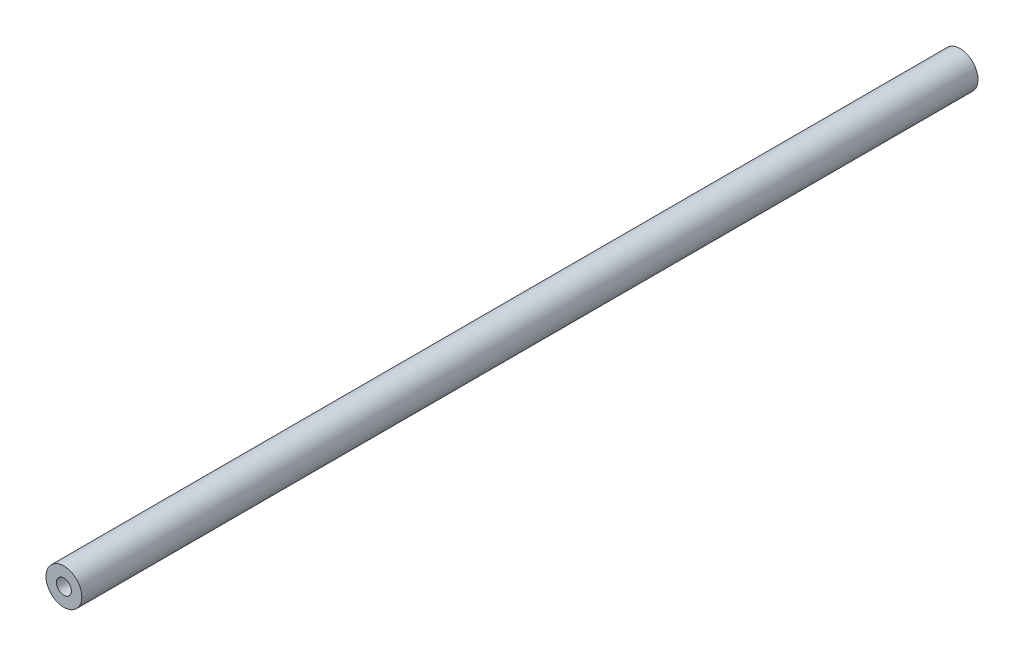
ISO-10303-21;
HEADER;
FILE_DESCRIPTION(('STEP AP214'),'2;1');
FILE_NAME('part.step','',(''),(''),'','','');
FILE_SCHEMA(('AUTOMOTIVE_DESIGN { 1 0 10303 214 1 1 1 1 }'));
ENDSEC;
DATA;
#1=APPLICATION_CONTEXT('core data for automotive mechanical design processes');
#2=APPLICATION_PROTOCOL_DEFINITION('international standard','automotive_design',2000,#1);
#3=PRODUCT_CONTEXT('',#1,'mechanical');
#4=PRODUCT('Part','Part','',(#3));
#5=PRODUCT_RELATED_PRODUCT_CATEGORY('part','',(#4));
#6=PRODUCT_DEFINITION_FORMATION('','',#4);
#7=PRODUCT_DEFINITION_CONTEXT('part definition',#1,'design');
#8=PRODUCT_DEFINITION('design','',#6,#7);
#9=PRODUCT_DEFINITION_SHAPE('','',#8);
#10=(LENGTH_UNIT() NAMED_UNIT(*) SI_UNIT(.MILLI.,.METRE.));
#11=(NAMED_UNIT(*) PLANE_ANGLE_UNIT() SI_UNIT($,.RADIAN.));
#12=(NAMED_UNIT(*) SI_UNIT($,.STERADIAN.) SOLID_ANGLE_UNIT());
#13=UNCERTAINTY_MEASURE_WITH_UNIT(LENGTH_MEASURE(1.E-05),#10,'distance_accuracy_value','');
#14=(GEOMETRIC_REPRESENTATION_CONTEXT(3) GLOBAL_UNCERTAINTY_ASSIGNED_CONTEXT((#13)) GLOBAL_UNIT_ASSIGNED_CONTEXT((#10,
#11,#12)) REPRESENTATION_CONTEXT('',''));
#15=CARTESIAN_POINT('',(0.,0.,0.));
#16=DIRECTION('',(0.,0.,1.));
#17=DIRECTION('',(1.,0.,0.));
#18=AXIS2_PLACEMENT_3D('',#15,#16,#17);
#19=CARTESIAN_POINT('',(0.,0.,150.));
#20=DIRECTION('',(0.,0.,-1.));
#21=DIRECTION('',(-1.,0.,0.));
#22=AXIS2_PLACEMENT_3D('',#19,#20,#21);
#23=CYLINDRICAL_SURFACE('',#22,6.);
#24=CARTESIAN_POINT('',(0.,0.,150.));
#25=DIRECTION('',(0.,0.,1.));
#26=DIRECTION('',(1.,0.,0.));
#27=AXIS2_PLACEMENT_3D('',#24,#25,#26);
#28=CIRCLE('',#27,6.);
#29=CARTESIAN_POINT('',(6.,0.,150.));
#30=VERTEX_POINT('',#29);
#31=EDGE_CURVE('E11',#30,#30,#28,.T.);
#32=ORIENTED_EDGE('',*,*,#31,.F.);
#33=EDGE_LOOP('',(#32));
#34=FACE_BOUND('',#33,.T.);
#35=CARTESIAN_POINT('',(0.,0.,-150.));
#36=DIRECTION('',(0.,0.,1.));
#37=DIRECTION('',(1.,0.,0.));
#38=AXIS2_PLACEMENT_3D('',#35,#36,#37);
#39=CIRCLE('',#38,6.);
#40=CARTESIAN_POINT('',(6.,0.,-150.));
#41=VERTEX_POINT('',#40);
#42=EDGE_CURVE('E42',#41,#41,#39,.T.);
#43=ORIENTED_EDGE('',*,*,#42,.T.);
#44=EDGE_LOOP('',(#43));
#45=FACE_BOUND('',#44,.T.);
#46=ADVANCED_FACE('F39',(#34,#45),#23,.T.);
#47=CARTESIAN_POINT('',(0.,0.,150.));
#48=DIRECTION('',(0.,0.,1.));
#49=DIRECTION('',(1.,0.,0.));
#50=AXIS2_PLACEMENT_3D('',#47,#48,#49);
#51=PLANE('',#50);
#52=CARTESIAN_POINT('',(0.,0.,150.));
#53=DIRECTION('',(0.,0.,1.));
#54=DIRECTION('',(1.,0.,0.));
#55=AXIS2_PLACEMENT_3D('',#52,#53,#54);
#56=CIRCLE('',#55,2.49999999999999);
#57=CARTESIAN_POINT('',(2.49999999999999,0.,150.));
#58=VERTEX_POINT('',#57);
#59=EDGE_CURVE('E63',#58,#58,#56,.T.);
#60=ORIENTED_EDGE('',*,*,#59,.F.);
#61=EDGE_LOOP('',(#60));
#62=FACE_BOUND('',#61,.T.);
#63=ORIENTED_EDGE('',*,*,#31,.T.);
#64=EDGE_LOOP('',(#63));
#65=FACE_BOUND('',#64,.T.);
#66=ADVANCED_FACE('F81',(#62,#65),#51,.T.);
#67=CARTESIAN_POINT('',(0.,0.,-150.));
#68=DIRECTION('',(0.,0.,1.));
#69=DIRECTION('',(1.,0.,0.));
#70=AXIS2_PLACEMENT_3D('',#67,#68,#69);
#71=PLANE('',#70);
#72=CARTESIAN_POINT('',(0.,0.,-150.));
#73=DIRECTION('',(0.,0.,-1.));
#74=DIRECTION('',(-1.,0.,0.));
#75=AXIS2_PLACEMENT_3D('',#72,#73,#74);
#76=CIRCLE('',#75,2.5);
#77=CARTESIAN_POINT('',(-2.5,0.,-150.));
#78=VERTEX_POINT('',#77);
#79=EDGE_CURVE('E62',#78,#78,#76,.T.);
#80=ORIENTED_EDGE('',*,*,#79,.F.);
#81=EDGE_LOOP('',(#80));
#82=FACE_BOUND('',#81,.T.);
#83=ORIENTED_EDGE('',*,*,#42,.F.);
#84=EDGE_LOOP('',(#83));
#85=FACE_BOUND('',#84,.T.);
#86=ADVANCED_FACE('F78',(#82,#85),#71,.F.);
#87=CARTESIAN_POINT('',(0.,0.,-135.));
#88=DIRECTION('',(0.,0.,-1.));
#89=DIRECTION('',(-1.,0.,0.));
#90=AXIS2_PLACEMENT_3D('',#87,#88,#89);
#91=CONICAL_SURFACE('',#90,2.5,1.02974425867665);
#92=CARTESIAN_POINT('',(0.,0.,-133.497848452431));
#93=VERTEX_POINT('',#92);
#94=VERTEX_LOOP('',#93);
#95=FACE_BOUND('',#94,.T.);
#96=CARTESIAN_POINT('',(0.,0.,-135.));
#97=DIRECTION('',(0.,0.,-1.));
#98=DIRECTION('',(-1.,0.,0.));
#99=AXIS2_PLACEMENT_3D('',#96,#97,#98);
#100=CIRCLE('',#99,2.5);
#101=CARTESIAN_POINT('',(-2.5,0.,-135.));
#102=VERTEX_POINT('',#101);
#103=EDGE_CURVE('E66',#102,#102,#100,.T.);
#104=ORIENTED_EDGE('',*,*,#103,.T.);
#105=EDGE_LOOP('',(#104));
#106=FACE_BOUND('',#105,.T.);
#107=ADVANCED_FACE('F80',(#95,#106),#91,.F.);
#108=CARTESIAN_POINT('',(0.,0.,-150.));
#109=DIRECTION('',(0.,0.,-1.));
#110=DIRECTION('',(-1.,0.,0.));
#111=AXIS2_PLACEMENT_3D('',#108,#109,#110);
#112=CYLINDRICAL_SURFACE('',#111,2.5);
#113=ORIENTED_EDGE('',*,*,#103,.F.);
#114=EDGE_LOOP('',(#113));
#115=FACE_BOUND('',#114,.T.);
#116=ORIENTED_EDGE('',*,*,#79,.T.);
#117=EDGE_LOOP('',(#116));
#118=FACE_BOUND('',#117,.T.);
#119=ADVANCED_FACE('F56',(#115,#118),#112,.F.);
#120=CARTESIAN_POINT('',(0.,0.,135.));
#121=DIRECTION('',(0.,0.,1.));
#122=DIRECTION('',(1.,0.,0.));
#123=AXIS2_PLACEMENT_3D('',#120,#121,#122);
#124=CONICAL_SURFACE('',#123,2.49999999999999,1.02974425867665);
#125=CARTESIAN_POINT('',(0.,0.,133.497848452431));
#126=VERTEX_POINT('',#125);
#127=VERTEX_LOOP('',#126);
#128=FACE_BOUND('',#127,.T.);
#129=CARTESIAN_POINT('',(0.,0.,135.));
#130=DIRECTION('',(0.,0.,1.));
#131=DIRECTION('',(1.,0.,0.));
#132=AXIS2_PLACEMENT_3D('',#129,#130,#131);
#133=CIRCLE('',#132,2.49999999999999);
#134=CARTESIAN_POINT('',(2.49999999999999,0.,135.));
#135=VERTEX_POINT('',#134);
#136=EDGE_CURVE('E60',#135,#135,#133,.T.);
#137=ORIENTED_EDGE('',*,*,#136,.T.);
#138=EDGE_LOOP('',(#137));
#139=FACE_BOUND('',#138,.T.);
#140=ADVANCED_FACE('F52',(#128,#139),#124,.F.);
#141=CARTESIAN_POINT('',(0.,0.,150.));
#142=DIRECTION('',(0.,0.,1.));
#143=DIRECTION('',(1.,0.,0.));
#144=AXIS2_PLACEMENT_3D('',#141,#142,#143);
#145=CYLINDRICAL_SURFACE('',#144,2.49999999999999);
#146=ORIENTED_EDGE('',*,*,#136,.F.);
#147=EDGE_LOOP('',(#146));
#148=FACE_BOUND('',#147,.T.);
#149=ORIENTED_EDGE('',*,*,#59,.T.);
#150=EDGE_LOOP('',(#149));
#151=FACE_BOUND('',#150,.T.);
#152=ADVANCED_FACE('F55',(#148,#151),#145,.F.);
#153=CLOSED_SHELL('',(#46,#66,#86,#107,#119,#140,#152));
#154=MANIFOLD_SOLID_BREP('B2',#153);
#155=ADVANCED_BREP_SHAPE_REPRESENTATION('',(#18,#154),#14);
#156=SHAPE_DEFINITION_REPRESENTATION(#9,#155);
ENDSEC;
END-ISO-10303-21;
